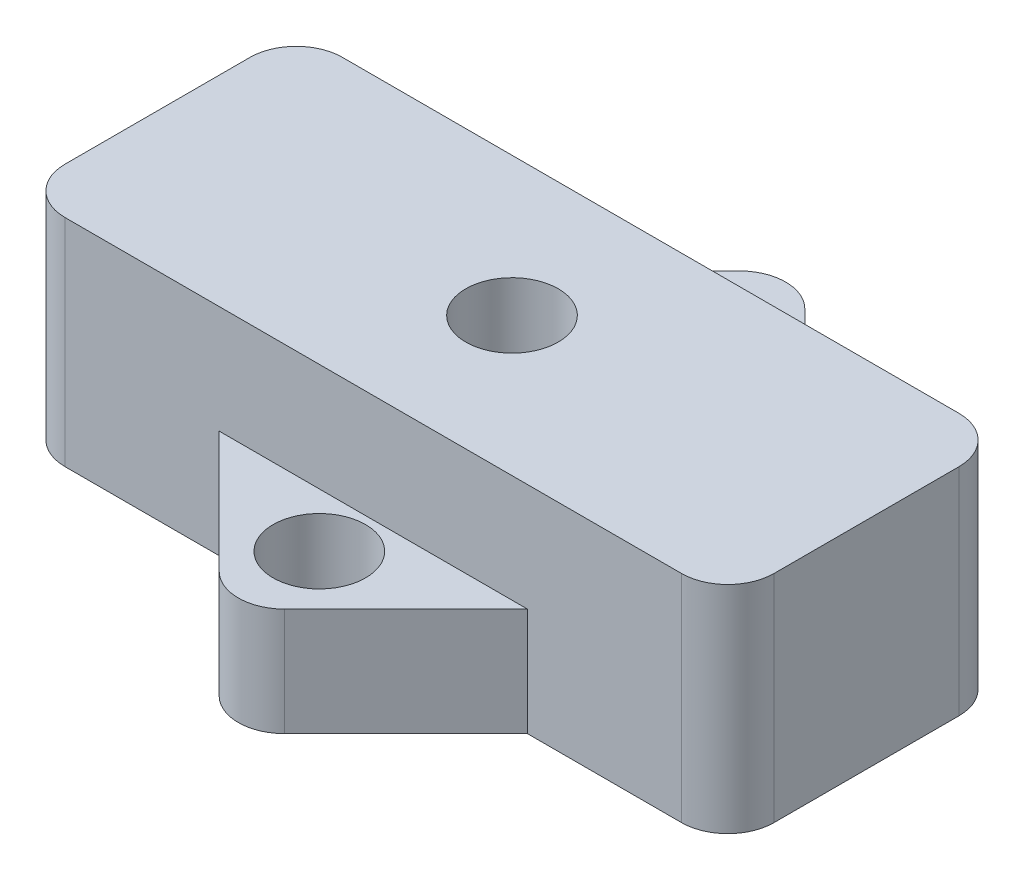
ISO-10303-21;
HEADER;
FILE_DESCRIPTION(('STEP AP214'),'2;1');
FILE_NAME('part.step','',(''),(''),'','','');
FILE_SCHEMA(('AUTOMOTIVE_DESIGN { 1 0 10303 214 1 1 1 1 }'));
ENDSEC;
DATA;
#1=APPLICATION_CONTEXT('core data for automotive mechanical design processes');
#2=APPLICATION_PROTOCOL_DEFINITION('international standard','automotive_design',2000,#1);
#3=PRODUCT_CONTEXT('',#1,'mechanical');
#4=PRODUCT('Part','Part','',(#3));
#5=PRODUCT_RELATED_PRODUCT_CATEGORY('part','',(#4));
#6=PRODUCT_DEFINITION_FORMATION('','',#4);
#7=PRODUCT_DEFINITION_CONTEXT('part definition',#1,'design');
#8=PRODUCT_DEFINITION('design','',#6,#7);
#9=PRODUCT_DEFINITION_SHAPE('','',#8);
#10=(LENGTH_UNIT() NAMED_UNIT(*) SI_UNIT(.MILLI.,.METRE.));
#11=(NAMED_UNIT(*) PLANE_ANGLE_UNIT() SI_UNIT($,.RADIAN.));
#12=(NAMED_UNIT(*) SI_UNIT($,.STERADIAN.) SOLID_ANGLE_UNIT());
#13=UNCERTAINTY_MEASURE_WITH_UNIT(LENGTH_MEASURE(1.E-05),#10,'distance_accuracy_value','');
#14=(GEOMETRIC_REPRESENTATION_CONTEXT(3) GLOBAL_UNCERTAINTY_ASSIGNED_CONTEXT((#13)) GLOBAL_UNIT_ASSIGNED_CONTEXT((#10,
#11,#12)) REPRESENTATION_CONTEXT('',''));
#15=CARTESIAN_POINT('',(0.,0.,0.));
#16=DIRECTION('',(0.,0.,1.));
#17=DIRECTION('',(1.,0.,0.));
#18=AXIS2_PLACEMENT_3D('',#15,#16,#17);
#19=CARTESIAN_POINT('',(20.,14.,-6.));
#20=DIRECTION('',(0.,-1.,0.));
#21=DIRECTION('',(0.,0.,-1.));
#22=AXIS2_PLACEMENT_3D('',#19,#20,#21);
#23=CYLINDRICAL_SURFACE('',#22,3.);
#24=CARTESIAN_POINT('',(20.,0.,-6.));
#25=DIRECTION('',(0.,1.,0.));
#26=DIRECTION('',(0.,0.,-1.));
#27=AXIS2_PLACEMENT_3D('',#24,#25,#26);
#28=CIRCLE('',#27,3.);
#29=CARTESIAN_POINT('',(23.,0.,-5.99999999999998));
#30=VERTEX_POINT('',#29);
#31=CARTESIAN_POINT('',(20.,0.,-9.));
#32=VERTEX_POINT('',#31);
#33=EDGE_CURVE('E203',#30,#32,#28,.T.);
#34=ORIENTED_EDGE('',*,*,#33,.T.);
#35=DIRECTION('',(0.,-1.,0.));
#36=VECTOR('',#35,1.);
#37=CARTESIAN_POINT('',(20.,14.,-9.));
#38=LINE('',#37,#36);
#39=CARTESIAN_POINT('',(20.,14.,-9.));
#40=VERTEX_POINT('',#39);
#41=EDGE_CURVE('E11',#40,#32,#38,.T.);
#42=ORIENTED_EDGE('',*,*,#41,.F.);
#43=CARTESIAN_POINT('',(20.,14.,-6.));
#44=DIRECTION('',(0.,1.,0.));
#45=DIRECTION('',(0.,0.,-1.));
#46=AXIS2_PLACEMENT_3D('',#43,#44,#45);
#47=CIRCLE('',#46,3.);
#48=CARTESIAN_POINT('',(23.,14.,-5.99999999999998));
#49=VERTEX_POINT('',#48);
#50=EDGE_CURVE('E248',#49,#40,#47,.T.);
#51=ORIENTED_EDGE('',*,*,#50,.F.);
#52=DIRECTION('',(0.,-1.,0.));
#53=VECTOR('',#52,1.);
#54=CARTESIAN_POINT('',(23.,14.,-5.99999999999998));
#55=LINE('',#54,#53);
#56=EDGE_CURVE('E274',#49,#30,#55,.T.);
#57=ORIENTED_EDGE('',*,*,#56,.T.);
#58=EDGE_LOOP('',(#34,#42,#51,#57));
#59=FACE_BOUND('',#58,.T.);
#60=ADVANCED_FACE('F45',(#59),#23,.T.);
#61=CARTESIAN_POINT('',(-20.,14.,-9.));
#62=DIRECTION('',(0.,0.,1.));
#63=DIRECTION('',(1.,0.,0.));
#64=AXIS2_PLACEMENT_3D('',#61,#62,#63);
#65=PLANE('',#64);
#66=DIRECTION('',(-1.,0.,0.));
#67=VECTOR('',#66,1.);
#68=CARTESIAN_POINT('',(-20.,0.,-9.));
#69=LINE('',#68,#67);
#70=CARTESIAN_POINT('',(9.99999999999999,0.,-9.));
#71=VERTEX_POINT('',#70);
#72=EDGE_CURVE('E279',#32,#71,#69,.T.);
#73=ORIENTED_EDGE('',*,*,#72,.T.);
#74=DIRECTION('',(0.,-1.,0.));
#75=VECTOR('',#74,1.);
#76=CARTESIAN_POINT('',(9.99999999999999,7.,-9.));
#77=LINE('',#76,#75);
#78=CARTESIAN_POINT('',(9.99999999999999,7.,-9.));
#79=VERTEX_POINT('',#78);
#80=EDGE_CURVE('E62',#79,#71,#77,.T.);
#81=ORIENTED_EDGE('',*,*,#80,.F.);
#82=DIRECTION('',(-1.,0.,0.));
#83=VECTOR('',#82,1.);
#84=CARTESIAN_POINT('',(-9.99999999999999,7.,-9.));
#85=LINE('',#84,#83);
#86=CARTESIAN_POINT('',(-9.99999999999999,7.,-9.));
#87=VERTEX_POINT('',#86);
#88=EDGE_CURVE('E66',#79,#87,#85,.T.);
#89=ORIENTED_EDGE('',*,*,#88,.T.);
#90=DIRECTION('',(0.,-1.,0.));
#91=VECTOR('',#90,1.);
#92=CARTESIAN_POINT('',(-9.99999999999999,7.,-9.));
#93=LINE('',#92,#91);
#94=CARTESIAN_POINT('',(-9.99999999999999,0.,-9.));
#95=VERTEX_POINT('',#94);
#96=EDGE_CURVE('E172',#87,#95,#93,.T.);
#97=ORIENTED_EDGE('',*,*,#96,.T.);
#98=CARTESIAN_POINT('',(-20.,0.,-9.));
#99=VERTEX_POINT('',#98);
#100=EDGE_CURVE('E278',#95,#99,#69,.T.);
#101=ORIENTED_EDGE('',*,*,#100,.T.);
#102=DIRECTION('',(0.,-1.,0.));
#103=VECTOR('',#102,1.);
#104=CARTESIAN_POINT('',(-20.,14.,-9.));
#105=LINE('',#104,#103);
#106=CARTESIAN_POINT('',(-20.,14.,-9.));
#107=VERTEX_POINT('',#106);
#108=EDGE_CURVE('E54',#107,#99,#105,.T.);
#109=ORIENTED_EDGE('',*,*,#108,.F.);
#110=DIRECTION('',(-1.,0.,0.));
#111=VECTOR('',#110,1.);
#112=CARTESIAN_POINT('',(-20.,14.,-9.));
#113=LINE('',#112,#111);
#114=EDGE_CURVE('E252',#40,#107,#113,.T.);
#115=ORIENTED_EDGE('',*,*,#114,.F.);
#116=ORIENTED_EDGE('',*,*,#41,.T.);
#117=EDGE_LOOP('',(#73,#81,#89,#97,#101,#109,#115,#116));
#118=FACE_BOUND('',#117,.T.);
#119=ADVANCED_FACE('F410',(#118),#65,.F.);
#120=CARTESIAN_POINT('',(-20.,14.,-6.));
#121=DIRECTION('',(0.,-1.,0.));
#122=DIRECTION('',(0.,0.,-1.));
#123=AXIS2_PLACEMENT_3D('',#120,#121,#122);
#124=CYLINDRICAL_SURFACE('',#123,3.);
#125=CARTESIAN_POINT('',(-20.,0.,-6.));
#126=DIRECTION('',(0.,1.,0.));
#127=DIRECTION('',(0.,0.,-1.));
#128=AXIS2_PLACEMENT_3D('',#125,#126,#127);
#129=CIRCLE('',#128,3.);
#130=CARTESIAN_POINT('',(-23.,0.,-5.99999999999998));
#131=VERTEX_POINT('',#130);
#132=EDGE_CURVE('E282',#99,#131,#129,.T.);
#133=ORIENTED_EDGE('',*,*,#132,.T.);
#134=DIRECTION('',(0.,-1.,0.));
#135=VECTOR('',#134,1.);
#136=CARTESIAN_POINT('',(-23.,14.,-5.99999999999998));
#137=LINE('',#136,#135);
#138=CARTESIAN_POINT('',(-23.,14.,-5.99999999999998));
#139=VERTEX_POINT('',#138);
#140=EDGE_CURVE('E319',#139,#131,#137,.T.);
#141=ORIENTED_EDGE('',*,*,#140,.F.);
#142=CARTESIAN_POINT('',(-20.,14.,-6.));
#143=DIRECTION('',(0.,1.,0.));
#144=DIRECTION('',(0.,0.,-1.));
#145=AXIS2_PLACEMENT_3D('',#142,#143,#144);
#146=CIRCLE('',#145,3.);
#147=EDGE_CURVE('E256',#107,#139,#146,.T.);
#148=ORIENTED_EDGE('',*,*,#147,.F.);
#149=ORIENTED_EDGE('',*,*,#108,.T.);
#150=EDGE_LOOP('',(#133,#141,#148,#149));
#151=FACE_BOUND('',#150,.T.);
#152=ADVANCED_FACE('F415',(#151),#124,.T.);
#153=CARTESIAN_POINT('',(-23.,14.,5.99999999999998));
#154=DIRECTION('',(1.,0.,0.));
#155=DIRECTION('',(0.,0.,-1.));
#156=AXIS2_PLACEMENT_3D('',#153,#154,#155);
#157=PLANE('',#156);
#158=DIRECTION('',(0.,0.,1.));
#159=VECTOR('',#158,1.);
#160=CARTESIAN_POINT('',(-23.,0.,5.99999999999998));
#161=LINE('',#160,#159);
#162=CARTESIAN_POINT('',(-23.,0.,5.99999999999998));
#163=VERTEX_POINT('',#162);
#164=EDGE_CURVE('E285',#131,#163,#161,.T.);
#165=ORIENTED_EDGE('',*,*,#164,.T.);
#166=DIRECTION('',(0.,-1.,0.));
#167=VECTOR('',#166,1.);
#168=CARTESIAN_POINT('',(-23.,14.,5.99999999999998));
#169=LINE('',#168,#167);
#170=CARTESIAN_POINT('',(-23.,14.,5.99999999999998));
#171=VERTEX_POINT('',#170);
#172=EDGE_CURVE('E315',#171,#163,#169,.T.);
#173=ORIENTED_EDGE('',*,*,#172,.F.);
#174=DIRECTION('',(0.,0.,1.));
#175=VECTOR('',#174,1.);
#176=CARTESIAN_POINT('',(-23.,14.,5.99999999999998));
#177=LINE('',#176,#175);
#178=EDGE_CURVE('E259',#139,#171,#177,.T.);
#179=ORIENTED_EDGE('',*,*,#178,.F.);
#180=ORIENTED_EDGE('',*,*,#140,.T.);
#181=EDGE_LOOP('',(#165,#173,#179,#180));
#182=FACE_BOUND('',#181,.T.);
#183=ADVANCED_FACE('F420',(#182),#157,.F.);
#184=CARTESIAN_POINT('',(-20.,14.,6.));
#185=DIRECTION('',(0.,-1.,0.));
#186=DIRECTION('',(0.,0.,-1.));
#187=AXIS2_PLACEMENT_3D('',#184,#185,#186);
#188=CYLINDRICAL_SURFACE('',#187,3.);
#189=CARTESIAN_POINT('',(-20.,0.,6.));
#190=DIRECTION('',(0.,1.,0.));
#191=DIRECTION('',(0.,0.,-1.));
#192=AXIS2_PLACEMENT_3D('',#189,#190,#191);
#193=CIRCLE('',#192,3.);
#194=CARTESIAN_POINT('',(-20.,0.,9.));
#195=VERTEX_POINT('',#194);
#196=EDGE_CURVE('E288',#163,#195,#193,.T.);
#197=ORIENTED_EDGE('',*,*,#196,.T.);
#198=DIRECTION('',(0.,-1.,0.));
#199=VECTOR('',#198,1.);
#200=CARTESIAN_POINT('',(-20.,14.,9.));
#201=LINE('',#200,#199);
#202=CARTESIAN_POINT('',(-20.,14.,9.));
#203=VERTEX_POINT('',#202);
#204=EDGE_CURVE('E311',#203,#195,#201,.T.);
#205=ORIENTED_EDGE('',*,*,#204,.F.);
#206=CARTESIAN_POINT('',(-20.,14.,6.));
#207=DIRECTION('',(0.,1.,0.));
#208=DIRECTION('',(0.,0.,-1.));
#209=AXIS2_PLACEMENT_3D('',#206,#207,#208);
#210=CIRCLE('',#209,3.);
#211=EDGE_CURVE('E262',#171,#203,#210,.T.);
#212=ORIENTED_EDGE('',*,*,#211,.F.);
#213=ORIENTED_EDGE('',*,*,#172,.T.);
#214=EDGE_LOOP('',(#197,#205,#212,#213));
#215=FACE_BOUND('',#214,.T.);
#216=ADVANCED_FACE('F426',(#215),#188,.T.);
#217=CARTESIAN_POINT('',(-20.,14.,9.));
#218=DIRECTION('',(0.,0.,-1.));
#219=DIRECTION('',(-1.,0.,0.));
#220=AXIS2_PLACEMENT_3D('',#217,#218,#219);
#221=PLANE('',#220);
#222=DIRECTION('',(1.,0.,0.));
#223=VECTOR('',#222,1.);
#224=CARTESIAN_POINT('',(-20.,0.,9.));
#225=LINE('',#224,#223);
#226=CARTESIAN_POINT('',(-9.99999999999999,0.,9.));
#227=VERTEX_POINT('',#226);
#228=EDGE_CURVE('E292',#195,#227,#225,.T.);
#229=ORIENTED_EDGE('',*,*,#228,.T.);
#230=DIRECTION('',(0.,-1.,0.));
#231=VECTOR('',#230,1.);
#232=CARTESIAN_POINT('',(-9.99999999999999,7.,9.));
#233=LINE('',#232,#231);
#234=CARTESIAN_POINT('',(-9.99999999999999,7.,9.));
#235=VERTEX_POINT('',#234);
#236=EDGE_CURVE('E219',#235,#227,#233,.T.);
#237=ORIENTED_EDGE('',*,*,#236,.F.);
#238=DIRECTION('',(1.,0.,0.));
#239=VECTOR('',#238,1.);
#240=CARTESIAN_POINT('',(-9.99999999999999,7.,9.));
#241=LINE('',#240,#239);
#242=CARTESIAN_POINT('',(9.99999999999999,7.,9.));
#243=VERTEX_POINT('',#242);
#244=EDGE_CURVE('E228',#235,#243,#241,.T.);
#245=ORIENTED_EDGE('',*,*,#244,.T.);
#246=DIRECTION('',(0.,-1.,0.));
#247=VECTOR('',#246,1.);
#248=CARTESIAN_POINT('',(9.99999999999999,7.,9.));
#249=LINE('',#248,#247);
#250=CARTESIAN_POINT('',(9.99999999999999,0.,9.));
#251=VERTEX_POINT('',#250);
#252=EDGE_CURVE('E208',#243,#251,#249,.T.);
#253=ORIENTED_EDGE('',*,*,#252,.T.);
#254=CARTESIAN_POINT('',(20.,0.,9.));
#255=VERTEX_POINT('',#254);
#256=EDGE_CURVE('E291',#251,#255,#225,.T.);
#257=ORIENTED_EDGE('',*,*,#256,.T.);
#258=DIRECTION('',(0.,-1.,0.));
#259=VECTOR('',#258,1.);
#260=CARTESIAN_POINT('',(20.,14.,9.));
#261=LINE('',#260,#259);
#262=CARTESIAN_POINT('',(20.,14.,9.));
#263=VERTEX_POINT('',#262);
#264=EDGE_CURVE('E307',#263,#255,#261,.T.);
#265=ORIENTED_EDGE('',*,*,#264,.F.);
#266=DIRECTION('',(1.,0.,0.));
#267=VECTOR('',#266,1.);
#268=CARTESIAN_POINT('',(-20.,14.,9.));
#269=LINE('',#268,#267);
#270=EDGE_CURVE('E265',#203,#263,#269,.T.);
#271=ORIENTED_EDGE('',*,*,#270,.F.);
#272=ORIENTED_EDGE('',*,*,#204,.T.);
#273=EDGE_LOOP('',(#229,#237,#245,#253,#257,#265,#271,#272));
#274=FACE_BOUND('',#273,.T.);
#275=ADVANCED_FACE('F380',(#274),#221,.F.);
#276=CARTESIAN_POINT('',(20.,14.,6.));
#277=DIRECTION('',(0.,-1.,0.));
#278=DIRECTION('',(0.,0.,-1.));
#279=AXIS2_PLACEMENT_3D('',#276,#277,#278);
#280=CYLINDRICAL_SURFACE('',#279,3.);
#281=CARTESIAN_POINT('',(20.,0.,6.));
#282=DIRECTION('',(0.,1.,0.));
#283=DIRECTION('',(0.,0.,1.));
#284=AXIS2_PLACEMENT_3D('',#281,#282,#283);
#285=CIRCLE('',#284,3.);
#286=CARTESIAN_POINT('',(23.,0.,5.99999999999998));
#287=VERTEX_POINT('',#286);
#288=EDGE_CURVE('E295',#255,#287,#285,.T.);
#289=ORIENTED_EDGE('',*,*,#288,.T.);
#290=DIRECTION('',(0.,-1.,0.));
#291=VECTOR('',#290,1.);
#292=CARTESIAN_POINT('',(23.,14.,5.99999999999998));
#293=LINE('',#292,#291);
#294=CARTESIAN_POINT('',(23.,14.,5.99999999999998));
#295=VERTEX_POINT('',#294);
#296=EDGE_CURVE('E303',#295,#287,#293,.T.);
#297=ORIENTED_EDGE('',*,*,#296,.F.);
#298=CARTESIAN_POINT('',(20.,14.,6.));
#299=DIRECTION('',(0.,1.,0.));
#300=DIRECTION('',(0.,0.,1.));
#301=AXIS2_PLACEMENT_3D('',#298,#299,#300);
#302=CIRCLE('',#301,3.);
#303=EDGE_CURVE('E268',#263,#295,#302,.T.);
#304=ORIENTED_EDGE('',*,*,#303,.F.);
#305=ORIENTED_EDGE('',*,*,#264,.T.);
#306=EDGE_LOOP('',(#289,#297,#304,#305));
#307=FACE_BOUND('',#306,.T.);
#308=ADVANCED_FACE('F374',(#307),#280,.T.);
#309=CARTESIAN_POINT('',(23.,14.,5.99999999999998));
#310=DIRECTION('',(-1.,0.,0.));
#311=DIRECTION('',(0.,0.,1.));
#312=AXIS2_PLACEMENT_3D('',#309,#310,#311);
#313=PLANE('',#312);
#314=DIRECTION('',(0.,0.,-1.));
#315=VECTOR('',#314,1.);
#316=CARTESIAN_POINT('',(23.,0.,5.99999999999998));
#317=LINE('',#316,#315);
#318=EDGE_CURVE('E253',#287,#30,#317,.T.);
#319=ORIENTED_EDGE('',*,*,#318,.T.);
#320=ORIENTED_EDGE('',*,*,#56,.F.);
#321=DIRECTION('',(0.,0.,-1.));
#322=VECTOR('',#321,1.);
#323=CARTESIAN_POINT('',(23.,14.,5.99999999999998));
#324=LINE('',#323,#322);
#325=EDGE_CURVE('E271',#295,#49,#324,.T.);
#326=ORIENTED_EDGE('',*,*,#325,.F.);
#327=ORIENTED_EDGE('',*,*,#296,.T.);
#328=EDGE_LOOP('',(#319,#320,#326,#327));
#329=FACE_BOUND('',#328,.T.);
#330=ADVANCED_FACE('F370',(#329),#313,.F.);
#331=CARTESIAN_POINT('',(20.,14.,-6.));
#332=DIRECTION('',(0.,-1.,0.));
#333=DIRECTION('',(0.,0.,-1.));
#334=AXIS2_PLACEMENT_3D('',#331,#332,#333);
#335=PLANE('',#334);
#336=CARTESIAN_POINT('',(0.,14.,0.));
#337=DIRECTION('',(0.,-1.,0.));
#338=DIRECTION('',(0.,0.,-1.));
#339=AXIS2_PLACEMENT_3D('',#336,#337,#338);
#340=CIRCLE('',#339,3.);
#341=CARTESIAN_POINT('',(0.,14.,-3.));
#342=VERTEX_POINT('',#341);
#343=EDGE_CURVE('E341',#342,#342,#340,.T.);
#344=ORIENTED_EDGE('',*,*,#343,.T.);
#345=EDGE_LOOP('',(#344));
#346=FACE_BOUND('',#345,.T.);
#347=ORIENTED_EDGE('',*,*,#50,.T.);
#348=ORIENTED_EDGE('',*,*,#114,.T.);
#349=ORIENTED_EDGE('',*,*,#147,.T.);
#350=ORIENTED_EDGE('',*,*,#178,.T.);
#351=ORIENTED_EDGE('',*,*,#211,.T.);
#352=ORIENTED_EDGE('',*,*,#270,.T.);
#353=ORIENTED_EDGE('',*,*,#303,.T.);
#354=ORIENTED_EDGE('',*,*,#325,.T.);
#355=EDGE_LOOP('',(#347,#348,#349,#350,#351,#352,#353,#354));
#356=FACE_BOUND('',#355,.T.);
#357=ADVANCED_FACE('F358',(#346,#356),#335,.F.);
#358=CARTESIAN_POINT('',(20.,0.,-6.));
#359=DIRECTION('',(0.,-1.,0.));
#360=DIRECTION('',(0.,0.,-1.));
#361=AXIS2_PLACEMENT_3D('',#358,#359,#360);
#362=PLANE('',#361);
#363=CARTESIAN_POINT('',(0.,0.,12.5));
#364=DIRECTION('',(0.,-1.,0.));
#365=DIRECTION('',(0.,0.,-1.));
#366=AXIS2_PLACEMENT_3D('',#363,#364,#365);
#367=CIRCLE('',#366,3.);
#368=CARTESIAN_POINT('',(0.,0.,9.5));
#369=VERTEX_POINT('',#368);
#370=EDGE_CURVE('E328',#369,#369,#367,.T.);
#371=ORIENTED_EDGE('',*,*,#370,.F.);
#372=EDGE_LOOP('',(#371));
#373=FACE_BOUND('',#372,.T.);
#374=CARTESIAN_POINT('',(0.,0.,0.));
#375=DIRECTION('',(0.,-1.,0.));
#376=DIRECTION('',(0.,0.,-1.));
#377=AXIS2_PLACEMENT_3D('',#374,#375,#376);
#378=CIRCLE('',#377,3.);
#379=CARTESIAN_POINT('',(0.,0.,-3.));
#380=VERTEX_POINT('',#379);
#381=EDGE_CURVE('E335',#380,#380,#378,.T.);
#382=ORIENTED_EDGE('',*,*,#381,.F.);
#383=EDGE_LOOP('',(#382));
#384=FACE_BOUND('',#383,.T.);
#385=CARTESIAN_POINT('',(0.,0.,-12.5));
#386=DIRECTION('',(0.,-1.,0.));
#387=DIRECTION('',(0.,0.,-1.));
#388=AXIS2_PLACEMENT_3D('',#385,#386,#387);
#389=CIRCLE('',#388,3.);
#390=CARTESIAN_POINT('',(0.,0.,-15.5));
#391=VERTEX_POINT('',#390);
#392=EDGE_CURVE('E346',#391,#391,#389,.T.);
#393=ORIENTED_EDGE('',*,*,#392,.F.);
#394=EDGE_LOOP('',(#393));
#395=FACE_BOUND('',#394,.T.);
#396=ORIENTED_EDGE('',*,*,#33,.F.);
#397=ORIENTED_EDGE('',*,*,#318,.F.);
#398=ORIENTED_EDGE('',*,*,#288,.F.);
#399=ORIENTED_EDGE('',*,*,#256,.F.);
#400=DIRECTION('',(-0.707106781186548,0.,0.707106781186547));
#401=VECTOR('',#400,1.);
#402=CARTESIAN_POINT('',(2.12132034355964,0.,16.8786796564404));
#403=LINE('',#402,#401);
#404=CARTESIAN_POINT('',(2.12132034355964,0.,16.8786796564404));
#405=VERTEX_POINT('',#404);
#406=EDGE_CURVE('E195',#251,#405,#403,.T.);
#407=ORIENTED_EDGE('',*,*,#406,.T.);
#408=CARTESIAN_POINT('',(0.,0.,14.7573593128807));
#409=DIRECTION('',(0.,-1.,0.));
#410=DIRECTION('',(0.,0.,-1.));
#411=AXIS2_PLACEMENT_3D('',#408,#409,#410);
#412=CIRCLE('',#411,3.);
#413=CARTESIAN_POINT('',(-2.12132034355964,0.,16.8786796564404));
#414=VERTEX_POINT('',#413);
#415=EDGE_CURVE('E227',#405,#414,#412,.T.);
#416=ORIENTED_EDGE('',*,*,#415,.T.);
#417=DIRECTION('',(-0.707106781186547,0.,-0.707106781186548));
#418=VECTOR('',#417,1.);
#419=CARTESIAN_POINT('',(-9.99999999999999,0.,9.));
#420=LINE('',#419,#418);
#421=EDGE_CURVE('E223',#414,#227,#420,.T.);
#422=ORIENTED_EDGE('',*,*,#421,.T.);
#423=ORIENTED_EDGE('',*,*,#228,.F.);
#424=ORIENTED_EDGE('',*,*,#196,.F.);
#425=ORIENTED_EDGE('',*,*,#164,.F.);
#426=ORIENTED_EDGE('',*,*,#132,.F.);
#427=ORIENTED_EDGE('',*,*,#100,.F.);
#428=DIRECTION('',(0.707106781186547,0.,-0.707106781186548));
#429=VECTOR('',#428,1.);
#430=CARTESIAN_POINT('',(-9.99999999999999,0.,-9.));
#431=LINE('',#430,#429);
#432=CARTESIAN_POINT('',(-2.12132034355964,0.,-16.8786796564404));
#433=VERTEX_POINT('',#432);
#434=EDGE_CURVE('E192',#95,#433,#431,.T.);
#435=ORIENTED_EDGE('',*,*,#434,.T.);
#436=CARTESIAN_POINT('',(0.,0.,-14.7573593128807));
#437=DIRECTION('',(0.,-1.,0.));
#438=DIRECTION('',(0.,0.,-1.));
#439=AXIS2_PLACEMENT_3D('',#436,#437,#438);
#440=CIRCLE('',#439,3.);
#441=CARTESIAN_POINT('',(2.12132034355964,0.,-16.8786796564404));
#442=VERTEX_POINT('',#441);
#443=EDGE_CURVE('E165',#433,#442,#440,.T.);
#444=ORIENTED_EDGE('',*,*,#443,.T.);
#445=DIRECTION('',(0.707106781186548,0.,0.707106781186547));
#446=VECTOR('',#445,1.);
#447=CARTESIAN_POINT('',(2.12132034355964,0.,-16.8786796564404));
#448=LINE('',#447,#446);
#449=EDGE_CURVE('E186',#442,#71,#448,.T.);
#450=ORIENTED_EDGE('',*,*,#449,.T.);
#451=ORIENTED_EDGE('',*,*,#72,.F.);
#452=EDGE_LOOP('',(#396,#397,#398,#399,#407,#416,#422,#423,#424,#425,#426,#427,#435,#444,#450,#451));
#453=FACE_BOUND('',#452,.T.);
#454=ADVANCED_FACE('F354',(#373,#384,#395,#453),#362,.T.);
#455=CARTESIAN_POINT('',(-9.99999999999999,7.,9.));
#456=DIRECTION('',(-0.707106781186548,0.,0.707106781186548));
#457=DIRECTION('',(0.707106781186547,0.,0.707106781186548));
#458=AXIS2_PLACEMENT_3D('',#455,#456,#457);
#459=PLANE('',#458);
#460=ORIENTED_EDGE('',*,*,#421,.F.);
#461=DIRECTION('',(0.,-1.,0.));
#462=VECTOR('',#461,1.);
#463=CARTESIAN_POINT('',(-2.12132034355964,7.,16.8786796564404));
#464=LINE('',#463,#462);
#465=CARTESIAN_POINT('',(-2.12132034355964,7.,16.8786796564404));
#466=VERTEX_POINT('',#465);
#467=EDGE_CURVE('E216',#466,#414,#464,.T.);
#468=ORIENTED_EDGE('',*,*,#467,.F.);
#469=DIRECTION('',(-0.707106781186547,0.,-0.707106781186548));
#470=VECTOR('',#469,1.);
#471=CARTESIAN_POINT('',(-9.99999999999999,7.,9.));
#472=LINE('',#471,#470);
#473=EDGE_CURVE('E212',#466,#235,#472,.T.);
#474=ORIENTED_EDGE('',*,*,#473,.T.);
#475=ORIENTED_EDGE('',*,*,#236,.T.);
#476=EDGE_LOOP('',(#460,#468,#474,#475));
#477=FACE_BOUND('',#476,.T.);
#478=ADVANCED_FACE('F357',(#477),#459,.T.);
#479=CARTESIAN_POINT('',(0.,7.,14.7573593128807));
#480=DIRECTION('',(0.,-1.,0.));
#481=DIRECTION('',(0.,0.,-1.));
#482=AXIS2_PLACEMENT_3D('',#479,#480,#481);
#483=CYLINDRICAL_SURFACE('',#482,3.);
#484=ORIENTED_EDGE('',*,*,#415,.F.);
#485=DIRECTION('',(0.,-1.,0.));
#486=VECTOR('',#485,1.);
#487=CARTESIAN_POINT('',(2.12132034355964,7.,16.8786796564404));
#488=LINE('',#487,#486);
#489=CARTESIAN_POINT('',(2.12132034355964,7.,16.8786796564404));
#490=VERTEX_POINT('',#489);
#491=EDGE_CURVE('E213',#490,#405,#488,.T.);
#492=ORIENTED_EDGE('',*,*,#491,.F.);
#493=CARTESIAN_POINT('',(0.,7.,14.7573593128807));
#494=DIRECTION('',(0.,-1.,0.));
#495=DIRECTION('',(0.,0.,-1.));
#496=AXIS2_PLACEMENT_3D('',#493,#494,#495);
#497=CIRCLE('',#496,3.);
#498=EDGE_CURVE('E238',#490,#466,#497,.T.);
#499=ORIENTED_EDGE('',*,*,#498,.T.);
#500=ORIENTED_EDGE('',*,*,#467,.T.);
#501=EDGE_LOOP('',(#484,#492,#499,#500));
#502=FACE_BOUND('',#501,.T.);
#503=ADVANCED_FACE('F388',(#502),#483,.T.);
#504=CARTESIAN_POINT('',(2.12132034355964,7.,16.8786796564404));
#505=DIRECTION('',(0.707106781186547,0.,0.707106781186548));
#506=DIRECTION('',(0.707106781186548,0.,-0.707106781186547));
#507=AXIS2_PLACEMENT_3D('',#504,#505,#506);
#508=PLANE('',#507);
#509=ORIENTED_EDGE('',*,*,#406,.F.);
#510=ORIENTED_EDGE('',*,*,#252,.F.);
#511=DIRECTION('',(-0.707106781186548,0.,0.707106781186547));
#512=VECTOR('',#511,1.);
#513=CARTESIAN_POINT('',(2.12132034355964,7.,16.8786796564404));
#514=LINE('',#513,#512);
#515=EDGE_CURVE('E242',#243,#490,#514,.T.);
#516=ORIENTED_EDGE('',*,*,#515,.T.);
#517=ORIENTED_EDGE('',*,*,#491,.T.);
#518=EDGE_LOOP('',(#509,#510,#516,#517));
#519=FACE_BOUND('',#518,.T.);
#520=ADVANCED_FACE('F384',(#519),#508,.T.);
#521=CARTESIAN_POINT('',(0.,7.,14.7573593128807));
#522=DIRECTION('',(0.,-1.,0.));
#523=DIRECTION('',(0.,0.,-1.));
#524=AXIS2_PLACEMENT_3D('',#521,#522,#523);
#525=PLANE('',#524);
#526=CARTESIAN_POINT('',(0.,7.,12.5));
#527=DIRECTION('',(0.,-1.,0.));
#528=DIRECTION('',(0.,0.,-1.));
#529=AXIS2_PLACEMENT_3D('',#526,#527,#528);
#530=CIRCLE('',#529,3.);
#531=CARTESIAN_POINT('',(0.,7.,9.5));
#532=VERTEX_POINT('',#531);
#533=EDGE_CURVE('E48',#532,#532,#530,.T.);
#534=ORIENTED_EDGE('',*,*,#533,.T.);
#535=EDGE_LOOP('',(#534));
#536=FACE_BOUND('',#535,.T.);
#537=ORIENTED_EDGE('',*,*,#244,.F.);
#538=ORIENTED_EDGE('',*,*,#473,.F.);
#539=ORIENTED_EDGE('',*,*,#498,.F.);
#540=ORIENTED_EDGE('',*,*,#515,.F.);
#541=EDGE_LOOP('',(#537,#538,#539,#540));
#542=FACE_BOUND('',#541,.T.);
#543=ADVANCED_FACE('F394',(#536,#542),#525,.F.);
#544=CARTESIAN_POINT('',(2.12132034355964,7.,-16.8786796564404));
#545=DIRECTION('',(0.707106781186547,0.,-0.707106781186548));
#546=DIRECTION('',(-0.707106781186548,0.,-0.707106781186547));
#547=AXIS2_PLACEMENT_3D('',#544,#545,#546);
#548=PLANE('',#547);
#549=ORIENTED_EDGE('',*,*,#449,.F.);
#550=DIRECTION('',(0.,-1.,0.));
#551=VECTOR('',#550,1.);
#552=CARTESIAN_POINT('',(2.12132034355964,7.,-16.8786796564404));
#553=LINE('',#552,#551);
#554=CARTESIAN_POINT('',(2.12132034355964,7.,-16.8786796564404));
#555=VERTEX_POINT('',#554);
#556=EDGE_CURVE('E171',#555,#442,#553,.T.);
#557=ORIENTED_EDGE('',*,*,#556,.F.);
#558=DIRECTION('',(0.707106781186548,0.,0.707106781186547));
#559=VECTOR('',#558,1.);
#560=CARTESIAN_POINT('',(2.12132034355964,7.,-16.8786796564404));
#561=LINE('',#560,#559);
#562=EDGE_CURVE('E179',#555,#79,#561,.T.);
#563=ORIENTED_EDGE('',*,*,#562,.T.);
#564=ORIENTED_EDGE('',*,*,#80,.T.);
#565=EDGE_LOOP('',(#549,#557,#563,#564));
#566=FACE_BOUND('',#565,.T.);
#567=ADVANCED_FACE('F396',(#566),#548,.T.);
#568=CARTESIAN_POINT('',(0.,7.,-14.7573593128807));
#569=DIRECTION('',(0.,-1.,0.));
#570=DIRECTION('',(0.,0.,-1.));
#571=AXIS2_PLACEMENT_3D('',#568,#569,#570);
#572=CYLINDRICAL_SURFACE('',#571,3.);
#573=ORIENTED_EDGE('',*,*,#443,.F.);
#574=DIRECTION('',(0.,-1.,0.));
#575=VECTOR('',#574,1.);
#576=CARTESIAN_POINT('',(-2.12132034355964,7.,-16.8786796564404));
#577=LINE('',#576,#575);
#578=CARTESIAN_POINT('',(-2.12132034355964,7.,-16.8786796564404));
#579=VERTEX_POINT('',#578);
#580=EDGE_CURVE('E159',#579,#433,#577,.T.);
#581=ORIENTED_EDGE('',*,*,#580,.F.);
#582=CARTESIAN_POINT('',(0.,7.,-14.7573593128807));
#583=DIRECTION('',(0.,-1.,0.));
#584=DIRECTION('',(0.,0.,-1.));
#585=AXIS2_PLACEMENT_3D('',#582,#583,#584);
#586=CIRCLE('',#585,3.);
#587=EDGE_CURVE('E162',#579,#555,#586,.T.);
#588=ORIENTED_EDGE('',*,*,#587,.T.);
#589=ORIENTED_EDGE('',*,*,#556,.T.);
#590=EDGE_LOOP('',(#573,#581,#588,#589));
#591=FACE_BOUND('',#590,.T.);
#592=ADVANCED_FACE('F161',(#591),#572,.T.);
#593=CARTESIAN_POINT('',(-9.99999999999999,7.,-9.));
#594=DIRECTION('',(-0.707106781186548,0.,-0.707106781186548));
#595=DIRECTION('',(-0.707106781186547,0.,0.707106781186548));
#596=AXIS2_PLACEMENT_3D('',#593,#594,#595);
#597=PLANE('',#596);
#598=ORIENTED_EDGE('',*,*,#434,.F.);
#599=ORIENTED_EDGE('',*,*,#96,.F.);
#600=DIRECTION('',(0.707106781186547,0.,-0.707106781186548));
#601=VECTOR('',#600,1.);
#602=CARTESIAN_POINT('',(-9.99999999999999,7.,-9.));
#603=LINE('',#602,#601);
#604=EDGE_CURVE('E177',#87,#579,#603,.T.);
#605=ORIENTED_EDGE('',*,*,#604,.T.);
#606=ORIENTED_EDGE('',*,*,#580,.T.);
#607=EDGE_LOOP('',(#598,#599,#605,#606));
#608=FACE_BOUND('',#607,.T.);
#609=ADVANCED_FACE('F182',(#608),#597,.T.);
#610=CARTESIAN_POINT('',(0.,7.,-14.7573593128807));
#611=DIRECTION('',(0.,-1.,0.));
#612=DIRECTION('',(0.,0.,-1.));
#613=AXIS2_PLACEMENT_3D('',#610,#611,#612);
#614=PLANE('',#613);
#615=CARTESIAN_POINT('',(0.,7.,-12.5));
#616=DIRECTION('',(0.,-1.,0.));
#617=DIRECTION('',(0.,0.,-1.));
#618=AXIS2_PLACEMENT_3D('',#615,#616,#617);
#619=CIRCLE('',#618,3.);
#620=CARTESIAN_POINT('',(0.,7.,-15.5));
#621=VERTEX_POINT('',#620);
#622=EDGE_CURVE('E325',#621,#621,#619,.T.);
#623=ORIENTED_EDGE('',*,*,#622,.T.);
#624=EDGE_LOOP('',(#623));
#625=FACE_BOUND('',#624,.T.);
#626=ORIENTED_EDGE('',*,*,#88,.F.);
#627=ORIENTED_EDGE('',*,*,#562,.F.);
#628=ORIENTED_EDGE('',*,*,#587,.F.);
#629=ORIENTED_EDGE('',*,*,#604,.F.);
#630=EDGE_LOOP('',(#626,#627,#628,#629));
#631=FACE_BOUND('',#630,.T.);
#632=ADVANCED_FACE('F176',(#625,#631),#614,.F.);
#633=CARTESIAN_POINT('',(0.,14.,-12.5));
#634=DIRECTION('',(0.,-1.,0.));
#635=DIRECTION('',(0.,0.,-1.));
#636=AXIS2_PLACEMENT_3D('',#633,#634,#635);
#637=CYLINDRICAL_SURFACE('',#636,3.);
#638=ORIENTED_EDGE('',*,*,#392,.T.);
#639=EDGE_LOOP('',(#638));
#640=FACE_BOUND('',#639,.T.);
#641=ORIENTED_EDGE('',*,*,#622,.F.);
#642=EDGE_LOOP('',(#641));
#643=FACE_BOUND('',#642,.T.);
#644=ADVANCED_FACE('F351',(#640,#643),#637,.F.);
#645=CARTESIAN_POINT('',(0.,14.,12.5));
#646=DIRECTION('',(0.,-1.,0.));
#647=DIRECTION('',(0.,0.,-1.));
#648=AXIS2_PLACEMENT_3D('',#645,#646,#647);
#649=CYLINDRICAL_SURFACE('',#648,3.);
#650=ORIENTED_EDGE('',*,*,#370,.T.);
#651=EDGE_LOOP('',(#650));
#652=FACE_BOUND('',#651,.T.);
#653=ORIENTED_EDGE('',*,*,#533,.F.);
#654=EDGE_LOOP('',(#653));
#655=FACE_BOUND('',#654,.T.);
#656=ADVANCED_FACE('F458',(#652,#655),#649,.F.);
#657=CARTESIAN_POINT('',(0.,14.,0.));
#658=DIRECTION('',(0.,-1.,0.));
#659=DIRECTION('',(0.,0.,-1.));
#660=AXIS2_PLACEMENT_3D('',#657,#658,#659);
#661=CYLINDRICAL_SURFACE('',#660,3.);
#662=ORIENTED_EDGE('',*,*,#343,.F.);
#663=EDGE_LOOP('',(#662));
#664=FACE_BOUND('',#663,.T.);
#665=ORIENTED_EDGE('',*,*,#381,.T.);
#666=EDGE_LOOP('',(#665));
#667=FACE_BOUND('',#666,.T.);
#668=ADVANCED_FACE('F455',(#664,#667),#661,.F.);
#669=CLOSED_SHELL('',(#60,#119,#152,#183,#216,#275,#308,#330,#357,#454,#478,#503,#520,#543,#567,
#592,#609,#632,#644,#656,#668));
#670=MANIFOLD_SOLID_BREP('B2',#669);
#671=ADVANCED_BREP_SHAPE_REPRESENTATION('',(#18,#670),#14);
#672=SHAPE_DEFINITION_REPRESENTATION(#9,#671);
ENDSEC;
END-ISO-10303-21;
